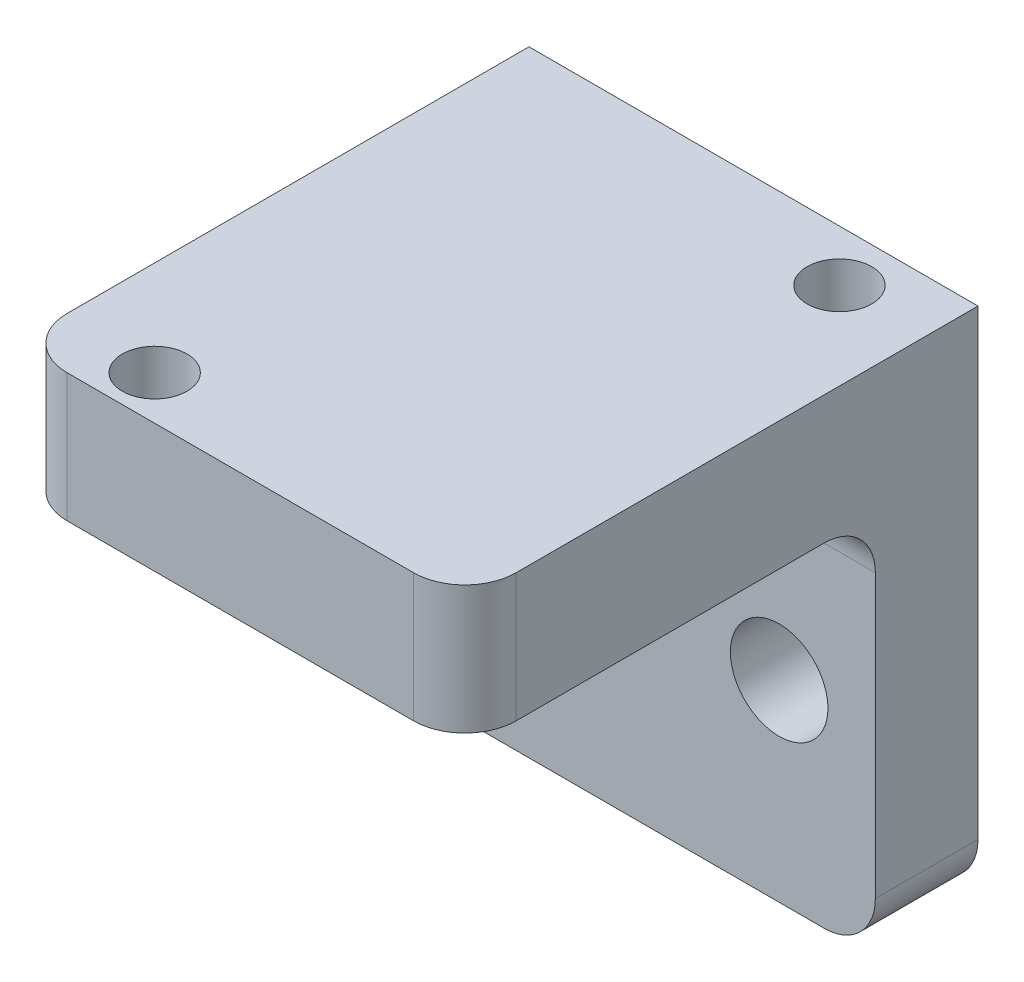
ISO-10303-21;
HEADER;
FILE_DESCRIPTION(('STEP AP214'),'2;1');
FILE_NAME('part.step','',(''),(''),'','','');
FILE_SCHEMA(('AUTOMOTIVE_DESIGN { 1 0 10303 214 1 1 1 1 }'));
ENDSEC;
DATA;
#1=APPLICATION_CONTEXT('core data for automotive mechanical design processes');
#2=APPLICATION_PROTOCOL_DEFINITION('international standard','automotive_design',2000,#1);
#3=PRODUCT_CONTEXT('',#1,'mechanical');
#4=PRODUCT('Part','Part','',(#3));
#5=PRODUCT_RELATED_PRODUCT_CATEGORY('part','',(#4));
#6=PRODUCT_DEFINITION_FORMATION('','',#4);
#7=PRODUCT_DEFINITION_CONTEXT('part definition',#1,'design');
#8=PRODUCT_DEFINITION('design','',#6,#7);
#9=PRODUCT_DEFINITION_SHAPE('','',#8);
#10=(LENGTH_UNIT() NAMED_UNIT(*) SI_UNIT(.MILLI.,.METRE.));
#11=(NAMED_UNIT(*) PLANE_ANGLE_UNIT() SI_UNIT($,.RADIAN.));
#12=(NAMED_UNIT(*) SI_UNIT($,.STERADIAN.) SOLID_ANGLE_UNIT());
#13=UNCERTAINTY_MEASURE_WITH_UNIT(LENGTH_MEASURE(1.E-05),#10,'distance_accuracy_value','');
#14=(GEOMETRIC_REPRESENTATION_CONTEXT(3) GLOBAL_UNCERTAINTY_ASSIGNED_CONTEXT((#13)) GLOBAL_UNIT_ASSIGNED_CONTEXT((#10,
#11,#12)) REPRESENTATION_CONTEXT('',''));
#15=CARTESIAN_POINT('',(0.,0.,0.));
#16=DIRECTION('',(0.,0.,1.));
#17=DIRECTION('',(1.,0.,0.));
#18=AXIS2_PLACEMENT_3D('',#15,#16,#17);
#19=CARTESIAN_POINT('',(0.,-6.35,0.));
#20=DIRECTION('',(0.,-1.,0.));
#21=DIRECTION('',(0.,0.,-1.));
#22=AXIS2_PLACEMENT_3D('',#19,#20,#21);
#23=PLANE('',#22);
#24=CARTESIAN_POINT('',(-3.04422557127848,-6.35,10.5293800792289));
#25=DIRECTION('',(0.,1.,0.));
#26=DIRECTION('',(0.,0.,1.));
#27=AXIS2_PLACEMENT_3D('',#24,#25,#26);
#28=CIRCLE('',#27,1.6002);
#29=CARTESIAN_POINT('',(-3.04422557127848,-6.35,12.1295800792289));
#30=VERTEX_POINT('',#29);
#31=EDGE_CURVE('E255',#30,#30,#28,.T.);
#32=ORIENTED_EDGE('',*,*,#31,.T.);
#33=EDGE_LOOP('',(#32));
#34=FACE_BOUND('',#33,.T.);
#35=DIRECTION('',(0.,0.,-1.));
#36=VECTOR('',#35,1.);
#37=CARTESIAN_POINT('',(14.4780000000001,-6.35,12.7));
#38=LINE('',#37,#36);
#39=CARTESIAN_POINT('',(14.4780000000001,-6.35,10.16));
#40=VERTEX_POINT('',#39);
#41=CARTESIAN_POINT('',(14.478,-6.35,-5.08));
#42=VERTEX_POINT('',#41);
#43=EDGE_CURVE('E163',#40,#42,#38,.T.);
#44=ORIENTED_EDGE('',*,*,#43,.F.);
#45=CARTESIAN_POINT('',(11.9380000000001,-6.35,10.16));
#46=DIRECTION('',(0.,-1.,0.));
#47=DIRECTION('',(0.,0.,-1.));
#48=AXIS2_PLACEMENT_3D('',#45,#46,#47);
#49=CIRCLE('',#48,2.54);
#50=CARTESIAN_POINT('',(11.9380000000001,-6.35,12.7));
#51=VERTEX_POINT('',#50);
#52=EDGE_CURVE('E55',#40,#51,#49,.T.);
#53=ORIENTED_EDGE('',*,*,#52,.T.);
#54=DIRECTION('',(1.,0.,0.));
#55=VECTOR('',#54,1.);
#56=CARTESIAN_POINT('',(-7.747,-6.35,12.7));
#57=LINE('',#56,#55);
#58=CARTESIAN_POINT('',(-5.207,-6.35,12.7));
#59=VERTEX_POINT('',#58);
#60=EDGE_CURVE('E137',#59,#51,#57,.T.);
#61=ORIENTED_EDGE('',*,*,#60,.F.);
#62=CARTESIAN_POINT('',(-5.207,-6.35,10.16));
#63=DIRECTION('',(0.,-1.,0.));
#64=DIRECTION('',(0.,0.,-1.));
#65=AXIS2_PLACEMENT_3D('',#62,#63,#64);
#66=CIRCLE('',#65,2.54);
#67=CARTESIAN_POINT('',(-7.747,-6.35,10.16));
#68=VERTEX_POINT('',#67);
#69=EDGE_CURVE('E215',#59,#68,#66,.T.);
#70=ORIENTED_EDGE('',*,*,#69,.T.);
#71=DIRECTION('',(0.,0.,1.));
#72=VECTOR('',#71,1.);
#73=CARTESIAN_POINT('',(-7.747,-6.35,12.7));
#74=LINE('',#73,#72);
#75=CARTESIAN_POINT('',(-7.747,-6.35,-5.08));
#76=VERTEX_POINT('',#75);
#77=EDGE_CURVE('E241',#76,#68,#74,.T.);
#78=ORIENTED_EDGE('',*,*,#77,.F.);
#79=DIRECTION('',(1.,0.,0.));
#80=VECTOR('',#79,1.);
#81=CARTESIAN_POINT('',(0.,-6.35,-5.08));
#82=LINE('',#81,#80);
#83=EDGE_CURVE('E211',#76,#42,#82,.T.);
#84=ORIENTED_EDGE('',*,*,#83,.T.);
#85=EDGE_LOOP('',(#44,#53,#61,#70,#78,#84));
#86=FACE_BOUND('',#85,.T.);
#87=ADVANCED_FACE('F39',(#34,#86),#23,.T.);
#88=CARTESIAN_POINT('',(14.4780000000001,-6.35,12.7));
#89=DIRECTION('',(1.,0.,0.));
#90=DIRECTION('',(0.,0.,-1.));
#91=AXIS2_PLACEMENT_3D('',#88,#89,#90);
#92=PLANE('',#91);
#93=DIRECTION('',(0.,-1.,0.));
#94=VECTOR('',#93,1.);
#95=CARTESIAN_POINT('',(14.478,-6.35,-7.62));
#96=LINE('',#95,#94);
#97=CARTESIAN_POINT('',(14.478,-8.89,-7.62));
#98=VERTEX_POINT('',#97);
#99=CARTESIAN_POINT('',(14.478,-22.86,-7.62));
#100=VERTEX_POINT('',#99);
#101=EDGE_CURVE('E222',#98,#100,#96,.T.);
#102=ORIENTED_EDGE('',*,*,#101,.T.);
#103=DIRECTION('',(0.,0.,-1.));
#104=VECTOR('',#103,1.);
#105=CARTESIAN_POINT('',(14.4780000000001,-22.86,12.7));
#106=LINE('',#105,#104);
#107=CARTESIAN_POINT('',(14.478,-22.86,-12.7));
#108=VERTEX_POINT('',#107);
#109=EDGE_CURVE('E132',#100,#108,#106,.T.);
#110=ORIENTED_EDGE('',*,*,#109,.T.);
#111=DIRECTION('',(0.,1.,0.));
#112=VECTOR('',#111,1.);
#113=CARTESIAN_POINT('',(14.478,-6.35,-12.7));
#114=LINE('',#113,#112);
#115=CARTESIAN_POINT('',(14.478,0.,-12.7));
#116=VERTEX_POINT('',#115);
#117=EDGE_CURVE('E125',#108,#116,#114,.T.);
#118=ORIENTED_EDGE('',*,*,#117,.T.);
#119=DIRECTION('',(0.,0.,-1.));
#120=VECTOR('',#119,1.);
#121=CARTESIAN_POINT('',(14.4780000000001,0.,12.7));
#122=LINE('',#121,#120);
#123=CARTESIAN_POINT('',(14.4780000000001,0.,10.16));
#124=VERTEX_POINT('',#123);
#125=EDGE_CURVE('E129',#124,#116,#122,.T.);
#126=ORIENTED_EDGE('',*,*,#125,.F.);
#127=DIRECTION('',(0.,1.,0.));
#128=VECTOR('',#127,1.);
#129=CARTESIAN_POINT('',(14.4780000000001,-6.35,10.16));
#130=LINE('',#129,#128);
#131=EDGE_CURVE('E165',#124,#40,#130,.F.);
#132=ORIENTED_EDGE('',*,*,#131,.T.);
#133=ORIENTED_EDGE('',*,*,#43,.T.);
#134=CARTESIAN_POINT('',(14.478,-8.89,-5.08));
#135=DIRECTION('',(1.,0.,0.));
#136=DIRECTION('',(0.,0.,-1.));
#137=AXIS2_PLACEMENT_3D('',#134,#135,#136);
#138=CIRCLE('',#137,2.54);
#139=EDGE_CURVE('E48',#42,#98,#138,.F.);
#140=ORIENTED_EDGE('',*,*,#139,.T.);
#141=EDGE_LOOP('',(#102,#110,#118,#126,#132,#133,#140));
#142=FACE_BOUND('',#141,.T.);
#143=ADVANCED_FACE('F128',(#142),#92,.T.);
#144=CARTESIAN_POINT('',(-7.747,-6.35,12.7));
#145=DIRECTION('',(0.,0.,1.));
#146=DIRECTION('',(1.,0.,0.));
#147=AXIS2_PLACEMENT_3D('',#144,#145,#146);
#148=PLANE('',#147);
#149=ORIENTED_EDGE('',*,*,#60,.T.);
#150=DIRECTION('',(0.,1.,0.));
#151=VECTOR('',#150,1.);
#152=CARTESIAN_POINT('',(11.9380000000001,-6.35,12.7));
#153=LINE('',#152,#151);
#154=CARTESIAN_POINT('',(11.9380000000001,0.,12.7));
#155=VERTEX_POINT('',#154);
#156=EDGE_CURVE('E202',#51,#155,#153,.T.);
#157=ORIENTED_EDGE('',*,*,#156,.T.);
#158=DIRECTION('',(1.,0.,0.));
#159=VECTOR('',#158,1.);
#160=CARTESIAN_POINT('',(-7.747,0.,12.7));
#161=LINE('',#160,#159);
#162=CARTESIAN_POINT('',(-5.207,0.,12.7));
#163=VERTEX_POINT('',#162);
#164=EDGE_CURVE('E157',#163,#155,#161,.T.);
#165=ORIENTED_EDGE('',*,*,#164,.F.);
#166=DIRECTION('',(0.,1.,0.));
#167=VECTOR('',#166,1.);
#168=CARTESIAN_POINT('',(-5.207,-6.35,12.7));
#169=LINE('',#168,#167);
#170=EDGE_CURVE('E62',#163,#59,#169,.F.);
#171=ORIENTED_EDGE('',*,*,#170,.T.);
#172=EDGE_LOOP('',(#149,#157,#165,#171));
#173=FACE_BOUND('',#172,.T.);
#174=ADVANCED_FACE('F320',(#173),#148,.T.);
#175=CARTESIAN_POINT('',(-7.747,-6.35,12.7));
#176=DIRECTION('',(-1.,0.,0.));
#177=DIRECTION('',(0.,0.,1.));
#178=AXIS2_PLACEMENT_3D('',#175,#176,#177);
#179=PLANE('',#178);
#180=DIRECTION('',(0.,1.,0.));
#181=VECTOR('',#180,1.);
#182=CARTESIAN_POINT('',(-7.747,-6.35,-12.7));
#183=LINE('',#182,#181);
#184=CARTESIAN_POINT('',(-7.747,-22.86,-12.7));
#185=VERTEX_POINT('',#184);
#186=CARTESIAN_POINT('',(-7.747,0.,-12.7));
#187=VERTEX_POINT('',#186);
#188=EDGE_CURVE('E136',#185,#187,#183,.T.);
#189=ORIENTED_EDGE('',*,*,#188,.F.);
#190=DIRECTION('',(0.,0.,-1.));
#191=VECTOR('',#190,1.);
#192=CARTESIAN_POINT('',(-7.747,-22.86,12.7));
#193=LINE('',#192,#191);
#194=CARTESIAN_POINT('',(-7.747,-22.86,-7.62));
#195=VERTEX_POINT('',#194);
#196=EDGE_CURVE('E197',#185,#195,#193,.F.);
#197=ORIENTED_EDGE('',*,*,#196,.T.);
#198=DIRECTION('',(0.,1.,0.));
#199=VECTOR('',#198,1.);
#200=CARTESIAN_POINT('',(-7.747,-6.35,-7.62));
#201=LINE('',#200,#199);
#202=CARTESIAN_POINT('',(-7.747,-8.89,-7.62));
#203=VERTEX_POINT('',#202);
#204=EDGE_CURVE('E243',#195,#203,#201,.T.);
#205=ORIENTED_EDGE('',*,*,#204,.T.);
#206=CARTESIAN_POINT('',(-7.747,-8.89,-5.08));
#207=DIRECTION('',(-1.,0.,0.));
#208=DIRECTION('',(0.,0.,1.));
#209=AXIS2_PLACEMENT_3D('',#206,#207,#208);
#210=CIRCLE('',#209,2.54);
#211=EDGE_CURVE('E11',#203,#76,#210,.F.);
#212=ORIENTED_EDGE('',*,*,#211,.T.);
#213=ORIENTED_EDGE('',*,*,#77,.T.);
#214=DIRECTION('',(0.,1.,0.));
#215=VECTOR('',#214,1.);
#216=CARTESIAN_POINT('',(-7.747,-6.35,10.16));
#217=LINE('',#216,#215);
#218=CARTESIAN_POINT('',(-7.747,0.,10.16));
#219=VERTEX_POINT('',#218);
#220=EDGE_CURVE('E193',#68,#219,#217,.T.);
#221=ORIENTED_EDGE('',*,*,#220,.T.);
#222=DIRECTION('',(0.,0.,1.));
#223=VECTOR('',#222,1.);
#224=CARTESIAN_POINT('',(-7.747,0.,12.7));
#225=LINE('',#224,#223);
#226=EDGE_CURVE('E154',#187,#219,#225,.T.);
#227=ORIENTED_EDGE('',*,*,#226,.F.);
#228=EDGE_LOOP('',(#189,#197,#205,#212,#213,#221,#227));
#229=FACE_BOUND('',#228,.T.);
#230=ADVANCED_FACE('F240',(#229),#179,.T.);
#231=CARTESIAN_POINT('',(-7.747,-6.35,-12.7));
#232=DIRECTION('',(0.,0.,-1.));
#233=DIRECTION('',(-1.,0.,0.));
#234=AXIS2_PLACEMENT_3D('',#231,#232,#233);
#235=PLANE('',#234);
#236=ORIENTED_EDGE('',*,*,#117,.F.);
#237=CARTESIAN_POINT('',(11.938,-22.86,-12.7));
#238=DIRECTION('',(0.,0.,-1.));
#239=DIRECTION('',(-1.,0.,0.));
#240=AXIS2_PLACEMENT_3D('',#237,#238,#239);
#241=CIRCLE('',#240,2.54);
#242=CARTESIAN_POINT('',(11.938,-25.4,-12.7));
#243=VERTEX_POINT('',#242);
#244=EDGE_CURVE('E174',#108,#243,#241,.T.);
#245=ORIENTED_EDGE('',*,*,#244,.T.);
#246=DIRECTION('',(-1.,0.,0.));
#247=VECTOR('',#246,1.);
#248=CARTESIAN_POINT('',(14.478,-25.4,-12.7));
#249=LINE('',#248,#247);
#250=CARTESIAN_POINT('',(-5.207,-25.4,-12.7));
#251=VERTEX_POINT('',#250);
#252=EDGE_CURVE('E234',#243,#251,#249,.T.);
#253=ORIENTED_EDGE('',*,*,#252,.T.);
#254=CARTESIAN_POINT('',(-5.207,-22.86,-12.7));
#255=DIRECTION('',(0.,0.,-1.));
#256=DIRECTION('',(-1.,0.,0.));
#257=AXIS2_PLACEMENT_3D('',#254,#255,#256);
#258=CIRCLE('',#257,2.54);
#259=EDGE_CURVE('E171',#251,#185,#258,.T.);
#260=ORIENTED_EDGE('',*,*,#259,.T.);
#261=ORIENTED_EDGE('',*,*,#188,.T.);
#262=DIRECTION('',(-1.,0.,0.));
#263=VECTOR('',#262,1.);
#264=CARTESIAN_POINT('',(-7.747,0.,-12.7));
#265=LINE('',#264,#263);
#266=EDGE_CURVE('E144',#116,#187,#265,.T.);
#267=ORIENTED_EDGE('',*,*,#266,.F.);
#268=EDGE_LOOP('',(#236,#245,#253,#260,#261,#267));
#269=FACE_BOUND('',#268,.T.);
#270=CARTESIAN_POINT('',(-2.9845,-15.875,-12.7));
#271=DIRECTION('',(0.,0.,-1.));
#272=DIRECTION('',(-1.,0.,0.));
#273=AXIS2_PLACEMENT_3D('',#270,#271,#272);
#274=CIRCLE('',#273,2.413);
#275=CARTESIAN_POINT('',(-5.3975,-15.875,-12.7));
#276=VERTEX_POINT('',#275);
#277=EDGE_CURVE('E283',#276,#276,#274,.T.);
#278=ORIENTED_EDGE('',*,*,#277,.F.);
#279=EDGE_LOOP('',(#278));
#280=FACE_BOUND('',#279,.T.);
#281=CARTESIAN_POINT('',(9.7155,-15.875,-12.7));
#282=DIRECTION('',(0.,0.,-1.));
#283=DIRECTION('',(-1.,0.,0.));
#284=AXIS2_PLACEMENT_3D('',#281,#282,#283);
#285=CIRCLE('',#284,2.413);
#286=CARTESIAN_POINT('',(7.3025,-15.875,-12.7));
#287=VERTEX_POINT('',#286);
#288=EDGE_CURVE('E275',#287,#287,#285,.T.);
#289=ORIENTED_EDGE('',*,*,#288,.F.);
#290=EDGE_LOOP('',(#289));
#291=FACE_BOUND('',#290,.T.);
#292=ADVANCED_FACE('F149',(#269,#280,#291),#235,.T.);
#293=CARTESIAN_POINT('',(0.,0.,0.));
#294=DIRECTION('',(0.,-1.,0.));
#295=DIRECTION('',(0.,0.,-1.));
#296=AXIS2_PLACEMENT_3D('',#293,#294,#295);
#297=PLANE('',#296);
#298=CARTESIAN_POINT('',(-3.04422557127848,0.,10.5293800792289));
#299=DIRECTION('',(0.,1.,0.));
#300=DIRECTION('',(0.,0.,1.));
#301=AXIS2_PLACEMENT_3D('',#298,#299,#300);
#302=CIRCLE('',#301,1.6002);
#303=CARTESIAN_POINT('',(-3.04422557127848,0.,12.1295800792289));
#304=VERTEX_POINT('',#303);
#305=EDGE_CURVE('E259',#304,#304,#302,.T.);
#306=ORIENTED_EDGE('',*,*,#305,.F.);
#307=EDGE_LOOP('',(#306));
#308=FACE_BOUND('',#307,.T.);
#309=CARTESIAN_POINT('',(10.16,0.,-10.16));
#310=DIRECTION('',(0.,1.,0.));
#311=DIRECTION('',(0.,0.,1.));
#312=AXIS2_PLACEMENT_3D('',#309,#310,#311);
#313=CIRCLE('',#312,1.6002);
#314=CARTESIAN_POINT('',(10.16,0.,-8.5598));
#315=VERTEX_POINT('',#314);
#316=EDGE_CURVE('E251',#315,#315,#313,.T.);
#317=ORIENTED_EDGE('',*,*,#316,.F.);
#318=EDGE_LOOP('',(#317));
#319=FACE_BOUND('',#318,.T.);
#320=ORIENTED_EDGE('',*,*,#164,.T.);
#321=CARTESIAN_POINT('',(11.9380000000001,0.,10.16));
#322=DIRECTION('',(0.,-1.,0.));
#323=DIRECTION('',(0.,0.,-1.));
#324=AXIS2_PLACEMENT_3D('',#321,#322,#323);
#325=CIRCLE('',#324,2.54);
#326=EDGE_CURVE('E145',#155,#124,#325,.F.);
#327=ORIENTED_EDGE('',*,*,#326,.T.);
#328=ORIENTED_EDGE('',*,*,#125,.T.);
#329=ORIENTED_EDGE('',*,*,#266,.T.);
#330=ORIENTED_EDGE('',*,*,#226,.T.);
#331=CARTESIAN_POINT('',(-5.207,0.,10.16));
#332=DIRECTION('',(0.,-1.,0.));
#333=DIRECTION('',(0.,0.,-1.));
#334=AXIS2_PLACEMENT_3D('',#331,#332,#333);
#335=CIRCLE('',#334,2.54);
#336=EDGE_CURVE('E206',#219,#163,#335,.F.);
#337=ORIENTED_EDGE('',*,*,#336,.T.);
#338=EDGE_LOOP('',(#320,#327,#328,#329,#330,#337));
#339=FACE_BOUND('',#338,.T.);
#340=ADVANCED_FACE('F142',(#308,#319,#339),#297,.F.);
#341=CARTESIAN_POINT('',(10.16,-6.35,-10.16));
#342=DIRECTION('',(0.,1.,0.));
#343=DIRECTION('',(0.,0.,1.));
#344=AXIS2_PLACEMENT_3D('',#341,#342,#343);
#345=CYLINDRICAL_SURFACE('',#344,1.6002);
#346=CARTESIAN_POINT('',(10.16,-6.35,-10.16));
#347=DIRECTION('',(0.,1.,0.));
#348=DIRECTION('',(0.,0.,1.));
#349=AXIS2_PLACEMENT_3D('',#346,#347,#348);
#350=CIRCLE('',#349,1.6002);
#351=CARTESIAN_POINT('',(10.16,-6.35,-8.5598));
#352=VERTEX_POINT('',#351);
#353=EDGE_CURVE('E147',#352,#352,#350,.T.);
#354=ORIENTED_EDGE('',*,*,#353,.F.);
#355=EDGE_LOOP('',(#354));
#356=FACE_BOUND('',#355,.T.);
#357=ORIENTED_EDGE('',*,*,#316,.T.);
#358=EDGE_LOOP('',(#357));
#359=FACE_BOUND('',#358,.T.);
#360=ADVANCED_FACE('F324',(#356,#359),#345,.F.);
#361=CARTESIAN_POINT('',(-3.04422557127848,-6.35,10.5293800792289));
#362=DIRECTION('',(0.,1.,0.));
#363=DIRECTION('',(0.,0.,1.));
#364=AXIS2_PLACEMENT_3D('',#361,#362,#363);
#365=CYLINDRICAL_SURFACE('',#364,1.6002);
#366=ORIENTED_EDGE('',*,*,#31,.F.);
#367=EDGE_LOOP('',(#366));
#368=FACE_BOUND('',#367,.T.);
#369=ORIENTED_EDGE('',*,*,#305,.T.);
#370=EDGE_LOOP('',(#369));
#371=FACE_BOUND('',#370,.T.);
#372=ADVANCED_FACE('F297',(#368,#371),#365,.F.);
#373=CARTESIAN_POINT('',(-2.9845,-15.875,-7.62));
#374=DIRECTION('',(0.,0.,-1.));
#375=DIRECTION('',(-1.,0.,0.));
#376=AXIS2_PLACEMENT_3D('',#373,#374,#375);
#377=CYLINDRICAL_SURFACE('',#376,2.413);
#378=CARTESIAN_POINT('',(-2.9845,-15.875,-7.62));
#379=DIRECTION('',(0.,0.,-1.));
#380=DIRECTION('',(-1.,0.,0.));
#381=AXIS2_PLACEMENT_3D('',#378,#379,#380);
#382=CIRCLE('',#381,2.413);
#383=CARTESIAN_POINT('',(-5.3975,-15.875,-7.62));
#384=VERTEX_POINT('',#383);
#385=EDGE_CURVE('E279',#384,#384,#382,.T.);
#386=ORIENTED_EDGE('',*,*,#385,.F.);
#387=EDGE_LOOP('',(#386));
#388=FACE_BOUND('',#387,.T.);
#389=ORIENTED_EDGE('',*,*,#277,.T.);
#390=EDGE_LOOP('',(#389));
#391=FACE_BOUND('',#390,.T.);
#392=ADVANCED_FACE('F293',(#388,#391),#377,.F.);
#393=CARTESIAN_POINT('',(9.7155,-15.875,-7.62));
#394=DIRECTION('',(0.,0.,-1.));
#395=DIRECTION('',(-1.,0.,0.));
#396=AXIS2_PLACEMENT_3D('',#393,#394,#395);
#397=CYLINDRICAL_SURFACE('',#396,2.413);
#398=CARTESIAN_POINT('',(9.7155,-15.875,-7.62));
#399=DIRECTION('',(0.,0.,-1.));
#400=DIRECTION('',(-1.,0.,0.));
#401=AXIS2_PLACEMENT_3D('',#398,#399,#400);
#402=CIRCLE('',#401,2.413);
#403=CARTESIAN_POINT('',(7.3025,-15.875,-7.62));
#404=VERTEX_POINT('',#403);
#405=EDGE_CURVE('E269',#404,#404,#402,.T.);
#406=ORIENTED_EDGE('',*,*,#405,.F.);
#407=EDGE_LOOP('',(#406));
#408=FACE_BOUND('',#407,.T.);
#409=ORIENTED_EDGE('',*,*,#288,.T.);
#410=EDGE_LOOP('',(#409));
#411=FACE_BOUND('',#410,.T.);
#412=ADVANCED_FACE('F296',(#408,#411),#397,.F.);
#413=CARTESIAN_POINT('',(0.,0.,-7.62));
#414=DIRECTION('',(0.,0.,-1.));
#415=DIRECTION('',(-1.,0.,0.));
#416=AXIS2_PLACEMENT_3D('',#413,#414,#415);
#417=PLANE('',#416);
#418=ORIENTED_EDGE('',*,*,#385,.T.);
#419=EDGE_LOOP('',(#418));
#420=FACE_BOUND('',#419,.T.);
#421=ORIENTED_EDGE('',*,*,#405,.T.);
#422=EDGE_LOOP('',(#421));
#423=FACE_BOUND('',#422,.T.);
#424=DIRECTION('',(-1.,0.,0.));
#425=VECTOR('',#424,1.);
#426=CARTESIAN_POINT('',(14.478,-25.4,-7.62));
#427=LINE('',#426,#425);
#428=CARTESIAN_POINT('',(11.938,-25.4,-7.62));
#429=VERTEX_POINT('',#428);
#430=CARTESIAN_POINT('',(-5.207,-25.4,-7.62));
#431=VERTEX_POINT('',#430);
#432=EDGE_CURVE('E233',#429,#431,#427,.T.);
#433=ORIENTED_EDGE('',*,*,#432,.F.);
#434=CARTESIAN_POINT('',(11.938,-22.86,-7.62));
#435=DIRECTION('',(0.,0.,-1.));
#436=DIRECTION('',(-1.,0.,0.));
#437=AXIS2_PLACEMENT_3D('',#434,#435,#436);
#438=CIRCLE('',#437,2.54);
#439=EDGE_CURVE('E190',#429,#100,#438,.F.);
#440=ORIENTED_EDGE('',*,*,#439,.T.);
#441=ORIENTED_EDGE('',*,*,#101,.F.);
#442=DIRECTION('',(1.,0.,0.));
#443=VECTOR('',#442,1.);
#444=CARTESIAN_POINT('',(0.,-8.89,-7.62));
#445=LINE('',#444,#443);
#446=EDGE_CURVE('E184',#98,#203,#445,.F.);
#447=ORIENTED_EDGE('',*,*,#446,.T.);
#448=ORIENTED_EDGE('',*,*,#204,.F.);
#449=CARTESIAN_POINT('',(-5.207,-22.86,-7.62));
#450=DIRECTION('',(0.,0.,-1.));
#451=DIRECTION('',(-1.,0.,0.));
#452=AXIS2_PLACEMENT_3D('',#449,#450,#451);
#453=CIRCLE('',#452,2.54);
#454=EDGE_CURVE('E187',#195,#431,#453,.F.);
#455=ORIENTED_EDGE('',*,*,#454,.T.);
#456=EDGE_LOOP('',(#433,#440,#441,#447,#448,#455));
#457=FACE_BOUND('',#456,.T.);
#458=ADVANCED_FACE('F228',(#420,#423,#457),#417,.F.);
#459=CARTESIAN_POINT('',(14.478,-25.4,-7.62));
#460=DIRECTION('',(0.,-1.,0.));
#461=DIRECTION('',(1.,0.,0.));
#462=AXIS2_PLACEMENT_3D('',#459,#460,#461);
#463=PLANE('',#462);
#464=ORIENTED_EDGE('',*,*,#252,.F.);
#465=DIRECTION('',(0.,0.,-1.));
#466=VECTOR('',#465,1.);
#467=CARTESIAN_POINT('',(11.938,-25.4,-7.61999999999999));
#468=LINE('',#467,#466);
#469=EDGE_CURVE('E181',#243,#429,#468,.F.);
#470=ORIENTED_EDGE('',*,*,#469,.T.);
#471=ORIENTED_EDGE('',*,*,#432,.T.);
#472=DIRECTION('',(0.,0.,-1.));
#473=VECTOR('',#472,1.);
#474=CARTESIAN_POINT('',(-5.207,-25.4,-7.62));
#475=LINE('',#474,#473);
#476=EDGE_CURVE('E177',#431,#251,#475,.T.);
#477=ORIENTED_EDGE('',*,*,#476,.T.);
#478=EDGE_LOOP('',(#464,#470,#471,#477));
#479=FACE_BOUND('',#478,.T.);
#480=ADVANCED_FACE('F311',(#479),#463,.T.);
#481=CARTESIAN_POINT('',(14.478,-6.35,-7.62));
#482=DIRECTION('',(0.,1.,0.));
#483=DIRECTION('',(0.,0.,1.));
#484=AXIS2_PLACEMENT_3D('',#481,#482,#483);
#485=PLANE('',#484);
#486=ORIENTED_EDGE('',*,*,#353,.T.);
#487=EDGE_LOOP('',(#486));
#488=FACE_BOUND('',#487,.T.);
#489=ADVANCED_FACE('F337',(#488),#485,.T.);
#490=CARTESIAN_POINT('',(11.9380000000001,-22.86,12.7));
#491=DIRECTION('',(0.,0.,-1.));
#492=DIRECTION('',(-1.,0.,0.));
#493=AXIS2_PLACEMENT_3D('',#490,#491,#492);
#494=CYLINDRICAL_SURFACE('',#493,2.54);
#495=ORIENTED_EDGE('',*,*,#439,.F.);
#496=ORIENTED_EDGE('',*,*,#469,.F.);
#497=ORIENTED_EDGE('',*,*,#244,.F.);
#498=ORIENTED_EDGE('',*,*,#109,.F.);
#499=EDGE_LOOP('',(#495,#496,#497,#498));
#500=FACE_BOUND('',#499,.T.);
#501=ADVANCED_FACE('F333',(#500),#494,.T.);
#502=CARTESIAN_POINT('',(-5.207,-22.86,-7.62));
#503=DIRECTION('',(0.,0.,-1.));
#504=DIRECTION('',(-1.,0.,0.));
#505=AXIS2_PLACEMENT_3D('',#502,#503,#504);
#506=CYLINDRICAL_SURFACE('',#505,2.54);
#507=ORIENTED_EDGE('',*,*,#454,.F.);
#508=ORIENTED_EDGE('',*,*,#196,.F.);
#509=ORIENTED_EDGE('',*,*,#259,.F.);
#510=ORIENTED_EDGE('',*,*,#476,.F.);
#511=EDGE_LOOP('',(#507,#508,#509,#510));
#512=FACE_BOUND('',#511,.T.);
#513=ADVANCED_FACE('F336',(#512),#506,.T.);
#514=CARTESIAN_POINT('',(11.9380000000001,-6.35,10.16));
#515=DIRECTION('',(0.,1.,0.));
#516=DIRECTION('',(0.,0.,1.));
#517=AXIS2_PLACEMENT_3D('',#514,#515,#516);
#518=CYLINDRICAL_SURFACE('',#517,2.54);
#519=ORIENTED_EDGE('',*,*,#52,.F.);
#520=ORIENTED_EDGE('',*,*,#131,.F.);
#521=ORIENTED_EDGE('',*,*,#326,.F.);
#522=ORIENTED_EDGE('',*,*,#156,.F.);
#523=EDGE_LOOP('',(#519,#520,#521,#522));
#524=FACE_BOUND('',#523,.T.);
#525=ADVANCED_FACE('F341',(#524),#518,.T.);
#526=CARTESIAN_POINT('',(-5.207,-6.35,10.16));
#527=DIRECTION('',(0.,1.,0.));
#528=DIRECTION('',(0.,0.,1.));
#529=AXIS2_PLACEMENT_3D('',#526,#527,#528);
#530=CYLINDRICAL_SURFACE('',#529,2.54);
#531=ORIENTED_EDGE('',*,*,#69,.F.);
#532=ORIENTED_EDGE('',*,*,#170,.F.);
#533=ORIENTED_EDGE('',*,*,#336,.F.);
#534=ORIENTED_EDGE('',*,*,#220,.F.);
#535=EDGE_LOOP('',(#531,#532,#533,#534));
#536=FACE_BOUND('',#535,.T.);
#537=ADVANCED_FACE('F344',(#536),#530,.T.);
#538=CARTESIAN_POINT('',(0.,-8.89,-5.08));
#539=DIRECTION('',(1.,0.,0.));
#540=DIRECTION('',(0.,0.,-1.));
#541=AXIS2_PLACEMENT_3D('',#538,#539,#540);
#542=CYLINDRICAL_SURFACE('',#541,2.54);
#543=ORIENTED_EDGE('',*,*,#211,.F.);
#544=ORIENTED_EDGE('',*,*,#446,.F.);
#545=ORIENTED_EDGE('',*,*,#139,.F.);
#546=ORIENTED_EDGE('',*,*,#83,.F.);
#547=EDGE_LOOP('',(#543,#544,#545,#546));
#548=FACE_BOUND('',#547,.T.);
#549=ADVANCED_FACE('F41',(#548),#542,.F.);
#550=CLOSED_SHELL('',(#87,#143,#174,#230,#292,#340,#360,#372,#392,#412,#458,#480,#489,#501,#513,
#525,#537,#549));
#551=MANIFOLD_SOLID_BREP('B2',#550);
#552=ADVANCED_BREP_SHAPE_REPRESENTATION('',(#18,#551),#14);
#553=SHAPE_DEFINITION_REPRESENTATION(#9,#552);
ENDSEC;
END-ISO-10303-21;
